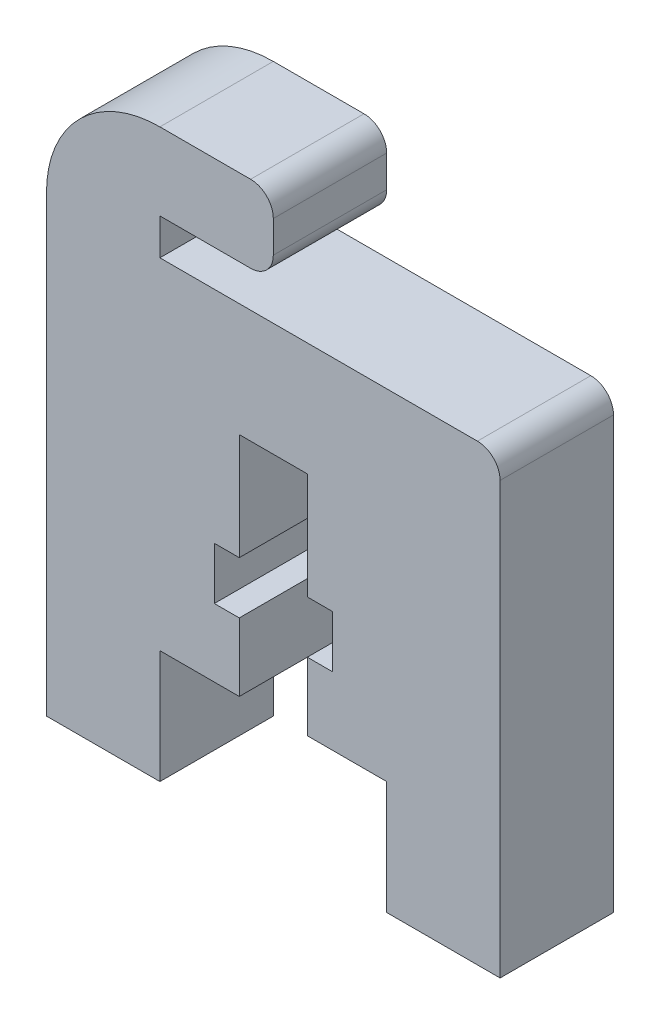
ISO-10303-21;
HEADER;
FILE_DESCRIPTION(('STEP AP214'),'2;1');
FILE_NAME('part.step','',(''),(''),'','','');
FILE_SCHEMA(('AUTOMOTIVE_DESIGN { 1 0 10303 214 1 1 1 1 }'));
ENDSEC;
DATA;
#1=APPLICATION_CONTEXT('core data for automotive mechanical design processes');
#2=APPLICATION_PROTOCOL_DEFINITION('international standard','automotive_design',2000,#1);
#3=PRODUCT_CONTEXT('',#1,'mechanical');
#4=PRODUCT('Part','Part','',(#3));
#5=PRODUCT_RELATED_PRODUCT_CATEGORY('part','',(#4));
#6=PRODUCT_DEFINITION_FORMATION('','',#4);
#7=PRODUCT_DEFINITION_CONTEXT('part definition',#1,'design');
#8=PRODUCT_DEFINITION('design','',#6,#7);
#9=PRODUCT_DEFINITION_SHAPE('','',#8);
#10=(LENGTH_UNIT() NAMED_UNIT(*) SI_UNIT(.MILLI.,.METRE.));
#11=(NAMED_UNIT(*) PLANE_ANGLE_UNIT() SI_UNIT($,.RADIAN.));
#12=(NAMED_UNIT(*) SI_UNIT($,.STERADIAN.) SOLID_ANGLE_UNIT());
#13=UNCERTAINTY_MEASURE_WITH_UNIT(LENGTH_MEASURE(1.E-05),#10,'distance_accuracy_value','');
#14=(GEOMETRIC_REPRESENTATION_CONTEXT(3) GLOBAL_UNCERTAINTY_ASSIGNED_CONTEXT((#13)) GLOBAL_UNIT_ASSIGNED_CONTEXT((#10,
#11,#12)) REPRESENTATION_CONTEXT('',''));
#15=CARTESIAN_POINT('',(0.,0.,0.));
#16=DIRECTION('',(0.,0.,1.));
#17=DIRECTION('',(1.,0.,0.));
#18=AXIS2_PLACEMENT_3D('',#15,#16,#17);
#19=CARTESIAN_POINT('',(5.,0.,5.));
#20=DIRECTION('',(0.,1.,0.));
#21=DIRECTION('',(0.,0.,1.));
#22=AXIS2_PLACEMENT_3D('',#19,#20,#21);
#23=PLANE('',#22);
#24=DIRECTION('',(1.,0.,0.));
#25=VECTOR('',#24,1.);
#26=CARTESIAN_POINT('',(5.,0.,0.));
#27=LINE('',#26,#25);
#28=CARTESIAN_POINT('',(0.,0.,0.));
#29=VERTEX_POINT('',#28);
#30=CARTESIAN_POINT('',(5.,0.,0.));
#31=VERTEX_POINT('',#30);
#32=EDGE_CURVE('E360',#29,#31,#27,.T.);
#33=ORIENTED_EDGE('',*,*,#32,.T.);
#34=DIRECTION('',(0.,0.,-1.));
#35=VECTOR('',#34,1.);
#36=CARTESIAN_POINT('',(5.,0.,5.));
#37=LINE('',#36,#35);
#38=CARTESIAN_POINT('',(5.,0.,5.));
#39=VERTEX_POINT('',#38);
#40=EDGE_CURVE('E233',#39,#31,#37,.T.);
#41=ORIENTED_EDGE('',*,*,#40,.F.);
#42=DIRECTION('',(1.,0.,0.));
#43=VECTOR('',#42,1.);
#44=CARTESIAN_POINT('',(5.,0.,5.));
#45=LINE('',#44,#43);
#46=CARTESIAN_POINT('',(0.,0.,5.));
#47=VERTEX_POINT('',#46);
#48=EDGE_CURVE('E219',#47,#39,#45,.T.);
#49=ORIENTED_EDGE('',*,*,#48,.F.);
#50=DIRECTION('',(0.,0.,-1.));
#51=VECTOR('',#50,1.);
#52=CARTESIAN_POINT('',(0.,0.,5.));
#53=LINE('',#52,#51);
#54=EDGE_CURVE('E231',#47,#29,#53,.T.);
#55=ORIENTED_EDGE('',*,*,#54,.T.);
#56=EDGE_LOOP('',(#33,#41,#49,#55));
#57=FACE_BOUND('',#56,.T.);
#58=ADVANCED_FACE('F32',(#57),#23,.F.);
#59=CARTESIAN_POINT('',(5.,0.,5.));
#60=DIRECTION('',(-1.,0.,0.));
#61=DIRECTION('',(0.,-1.,0.));
#62=AXIS2_PLACEMENT_3D('',#59,#60,#61);
#63=PLANE('',#62);
#64=DIRECTION('',(0.,1.,0.));
#65=VECTOR('',#64,1.);
#66=CARTESIAN_POINT('',(5.,0.,0.));
#67=LINE('',#66,#65);
#68=CARTESIAN_POINT('',(5.,5.,0.));
#69=VERTEX_POINT('',#68);
#70=EDGE_CURVE('E354',#31,#69,#67,.T.);
#71=ORIENTED_EDGE('',*,*,#70,.T.);
#72=DIRECTION('',(0.,0.,-1.));
#73=VECTOR('',#72,1.);
#74=CARTESIAN_POINT('',(5.,5.,5.));
#75=LINE('',#74,#73);
#76=CARTESIAN_POINT('',(5.,5.,5.));
#77=VERTEX_POINT('',#76);
#78=EDGE_CURVE('E244',#77,#69,#75,.T.);
#79=ORIENTED_EDGE('',*,*,#78,.F.);
#80=DIRECTION('',(0.,1.,0.));
#81=VECTOR('',#80,1.);
#82=CARTESIAN_POINT('',(5.,0.,5.));
#83=LINE('',#82,#81);
#84=EDGE_CURVE('E235',#39,#77,#83,.T.);
#85=ORIENTED_EDGE('',*,*,#84,.F.);
#86=ORIENTED_EDGE('',*,*,#40,.T.);
#87=EDGE_LOOP('',(#71,#79,#85,#86));
#88=FACE_BOUND('',#87,.T.);
#89=ADVANCED_FACE('F417',(#88),#63,.F.);
#90=CARTESIAN_POINT('',(8.50000000000001,5.,5.));
#91=DIRECTION('',(0.,1.,0.));
#92=DIRECTION('',(-1.,0.,0.));
#93=AXIS2_PLACEMENT_3D('',#90,#91,#92);
#94=PLANE('',#93);
#95=DIRECTION('',(1.,0.,0.));
#96=VECTOR('',#95,1.);
#97=CARTESIAN_POINT('',(8.50000000000001,5.,0.));
#98=LINE('',#97,#96);
#99=CARTESIAN_POINT('',(8.50000000000001,5.,0.));
#100=VERTEX_POINT('',#99);
#101=EDGE_CURVE('E349',#69,#100,#98,.T.);
#102=ORIENTED_EDGE('',*,*,#101,.T.);
#103=DIRECTION('',(0.,0.,-1.));
#104=VECTOR('',#103,1.);
#105=CARTESIAN_POINT('',(8.50000000000001,5.,5.));
#106=LINE('',#105,#104);
#107=CARTESIAN_POINT('',(8.50000000000001,5.,5.));
#108=VERTEX_POINT('',#107);
#109=EDGE_CURVE('E340',#108,#100,#106,.T.);
#110=ORIENTED_EDGE('',*,*,#109,.F.);
#111=DIRECTION('',(1.,0.,0.));
#112=VECTOR('',#111,1.);
#113=CARTESIAN_POINT('',(8.50000000000001,5.,5.));
#114=LINE('',#113,#112);
#115=EDGE_CURVE('E350',#77,#108,#114,.T.);
#116=ORIENTED_EDGE('',*,*,#115,.F.);
#117=ORIENTED_EDGE('',*,*,#78,.T.);
#118=EDGE_LOOP('',(#102,#110,#116,#117));
#119=FACE_BOUND('',#118,.T.);
#120=ADVANCED_FACE('F347',(#119),#94,.F.);
#121=CARTESIAN_POINT('',(8.5,8.,5.));
#122=DIRECTION('',(-1.,0.,0.));
#123=DIRECTION('',(0.,-1.,0.));
#124=AXIS2_PLACEMENT_3D('',#121,#122,#123);
#125=PLANE('',#124);
#126=DIRECTION('',(0.,1.,0.));
#127=VECTOR('',#126,1.);
#128=CARTESIAN_POINT('',(8.5,8.,0.));
#129=LINE('',#128,#127);
#130=CARTESIAN_POINT('',(8.5,8.,0.));
#131=VERTEX_POINT('',#130);
#132=EDGE_CURVE('E356',#100,#131,#129,.T.);
#133=ORIENTED_EDGE('',*,*,#132,.T.);
#134=DIRECTION('',(0.,0.,-1.));
#135=VECTOR('',#134,1.);
#136=CARTESIAN_POINT('',(8.5,8.,5.));
#137=LINE('',#136,#135);
#138=CARTESIAN_POINT('',(8.5,8.,5.));
#139=VERTEX_POINT('',#138);
#140=EDGE_CURVE('E337',#139,#131,#137,.T.);
#141=ORIENTED_EDGE('',*,*,#140,.F.);
#142=DIRECTION('',(0.,1.,0.));
#143=VECTOR('',#142,1.);
#144=CARTESIAN_POINT('',(8.5,8.,5.));
#145=LINE('',#144,#143);
#146=EDGE_CURVE('E419',#108,#139,#145,.T.);
#147=ORIENTED_EDGE('',*,*,#146,.F.);
#148=ORIENTED_EDGE('',*,*,#109,.T.);
#149=EDGE_LOOP('',(#133,#141,#147,#148));
#150=FACE_BOUND('',#149,.T.);
#151=ADVANCED_FACE('F536',(#150),#125,.F.);
#152=CARTESIAN_POINT('',(8.5,8.,5.));
#153=DIRECTION('',(0.,-1.,0.));
#154=DIRECTION('',(1.,0.,0.));
#155=AXIS2_PLACEMENT_3D('',#152,#153,#154);
#156=PLANE('',#155);
#157=DIRECTION('',(-1.,0.,0.));
#158=VECTOR('',#157,1.);
#159=CARTESIAN_POINT('',(8.5,8.,0.));
#160=LINE('',#159,#158);
#161=CARTESIAN_POINT('',(7.4,8.00000000000001,0.));
#162=VERTEX_POINT('',#161);
#163=EDGE_CURVE('E358',#131,#162,#160,.T.);
#164=ORIENTED_EDGE('',*,*,#163,.T.);
#165=DIRECTION('',(0.,0.,-1.));
#166=VECTOR('',#165,1.);
#167=CARTESIAN_POINT('',(7.4,8.00000000000001,5.));
#168=LINE('',#167,#166);
#169=CARTESIAN_POINT('',(7.4,8.00000000000001,5.));
#170=VERTEX_POINT('',#169);
#171=EDGE_CURVE('E334',#170,#162,#168,.T.);
#172=ORIENTED_EDGE('',*,*,#171,.F.);
#173=DIRECTION('',(-1.,0.,0.));
#174=VECTOR('',#173,1.);
#175=CARTESIAN_POINT('',(8.5,8.,5.));
#176=LINE('',#175,#174);
#177=EDGE_CURVE('E423',#139,#170,#176,.T.);
#178=ORIENTED_EDGE('',*,*,#177,.F.);
#179=ORIENTED_EDGE('',*,*,#140,.T.);
#180=EDGE_LOOP('',(#164,#172,#178,#179));
#181=FACE_BOUND('',#180,.T.);
#182=ADVANCED_FACE('F532',(#181),#156,.F.);
#183=CARTESIAN_POINT('',(7.4,8.00000000000001,5.));
#184=DIRECTION('',(-1.,0.,0.));
#185=DIRECTION('',(0.,-1.,0.));
#186=AXIS2_PLACEMENT_3D('',#183,#184,#185);
#187=PLANE('',#186);
#188=DIRECTION('',(0.,1.,0.));
#189=VECTOR('',#188,1.);
#190=CARTESIAN_POINT('',(7.4,8.00000000000001,0.));
#191=LINE('',#190,#189);
#192=CARTESIAN_POINT('',(7.4,10.3,0.));
#193=VERTEX_POINT('',#192);
#194=EDGE_CURVE('E365',#162,#193,#191,.T.);
#195=ORIENTED_EDGE('',*,*,#194,.T.);
#196=DIRECTION('',(0.,0.,-1.));
#197=VECTOR('',#196,1.);
#198=CARTESIAN_POINT('',(7.4,10.3,5.));
#199=LINE('',#198,#197);
#200=CARTESIAN_POINT('',(7.4,10.3,5.));
#201=VERTEX_POINT('',#200);
#202=EDGE_CURVE('E331',#201,#193,#199,.T.);
#203=ORIENTED_EDGE('',*,*,#202,.F.);
#204=DIRECTION('',(0.,1.,0.));
#205=VECTOR('',#204,1.);
#206=CARTESIAN_POINT('',(7.4,8.00000000000001,5.));
#207=LINE('',#206,#205);
#208=EDGE_CURVE('E425',#170,#201,#207,.T.);
#209=ORIENTED_EDGE('',*,*,#208,.F.);
#210=ORIENTED_EDGE('',*,*,#171,.T.);
#211=EDGE_LOOP('',(#195,#203,#209,#210));
#212=FACE_BOUND('',#211,.T.);
#213=ADVANCED_FACE('F528',(#212),#187,.F.);
#214=CARTESIAN_POINT('',(7.4,10.3,5.));
#215=DIRECTION('',(0.,1.,0.));
#216=DIRECTION('',(-1.,0.,0.));
#217=AXIS2_PLACEMENT_3D('',#214,#215,#216);
#218=PLANE('',#217);
#219=DIRECTION('',(1.,0.,0.));
#220=VECTOR('',#219,1.);
#221=CARTESIAN_POINT('',(7.4,10.3,0.));
#222=LINE('',#221,#220);
#223=CARTESIAN_POINT('',(8.5,10.3,0.));
#224=VERTEX_POINT('',#223);
#225=EDGE_CURVE('E367',#193,#224,#222,.T.);
#226=ORIENTED_EDGE('',*,*,#225,.T.);
#227=DIRECTION('',(0.,0.,-1.));
#228=VECTOR('',#227,1.);
#229=CARTESIAN_POINT('',(8.5,10.3,5.));
#230=LINE('',#229,#228);
#231=CARTESIAN_POINT('',(8.5,10.3,5.));
#232=VERTEX_POINT('',#231);
#233=EDGE_CURVE('E328',#232,#224,#230,.T.);
#234=ORIENTED_EDGE('',*,*,#233,.F.);
#235=DIRECTION('',(1.,0.,0.));
#236=VECTOR('',#235,1.);
#237=CARTESIAN_POINT('',(7.4,10.3,5.));
#238=LINE('',#237,#236);
#239=EDGE_CURVE('E427',#201,#232,#238,.T.);
#240=ORIENTED_EDGE('',*,*,#239,.F.);
#241=ORIENTED_EDGE('',*,*,#202,.T.);
#242=EDGE_LOOP('',(#226,#234,#240,#241));
#243=FACE_BOUND('',#242,.T.);
#244=ADVANCED_FACE('F523',(#243),#218,.F.);
#245=CARTESIAN_POINT('',(8.5,15.,5.));
#246=DIRECTION('',(-1.,0.,0.));
#247=DIRECTION('',(0.,-1.,0.));
#248=AXIS2_PLACEMENT_3D('',#245,#246,#247);
#249=PLANE('',#248);
#250=DIRECTION('',(0.,1.,0.));
#251=VECTOR('',#250,1.);
#252=CARTESIAN_POINT('',(8.5,15.,0.));
#253=LINE('',#252,#251);
#254=CARTESIAN_POINT('',(8.5,15.,0.));
#255=VERTEX_POINT('',#254);
#256=EDGE_CURVE('E369',#224,#255,#253,.T.);
#257=ORIENTED_EDGE('',*,*,#256,.T.);
#258=DIRECTION('',(0.,0.,-1.));
#259=VECTOR('',#258,1.);
#260=CARTESIAN_POINT('',(8.5,15.,5.));
#261=LINE('',#260,#259);
#262=CARTESIAN_POINT('',(8.5,15.,5.));
#263=VERTEX_POINT('',#262);
#264=EDGE_CURVE('E325',#263,#255,#261,.T.);
#265=ORIENTED_EDGE('',*,*,#264,.F.);
#266=DIRECTION('',(0.,1.,0.));
#267=VECTOR('',#266,1.);
#268=CARTESIAN_POINT('',(8.5,15.,5.));
#269=LINE('',#268,#267);
#270=EDGE_CURVE('E429',#232,#263,#269,.T.);
#271=ORIENTED_EDGE('',*,*,#270,.F.);
#272=ORIENTED_EDGE('',*,*,#233,.T.);
#273=EDGE_LOOP('',(#257,#265,#271,#272));
#274=FACE_BOUND('',#273,.T.);
#275=ADVANCED_FACE('F518',(#274),#249,.F.);
#276=CARTESIAN_POINT('',(11.5,15.,5.));
#277=DIRECTION('',(0.,1.,0.));
#278=DIRECTION('',(0.,0.,1.));
#279=AXIS2_PLACEMENT_3D('',#276,#277,#278);
#280=PLANE('',#279);
#281=DIRECTION('',(1.,0.,0.));
#282=VECTOR('',#281,1.);
#283=CARTESIAN_POINT('',(11.5,15.,0.));
#284=LINE('',#283,#282);
#285=CARTESIAN_POINT('',(11.5,15.,0.));
#286=VERTEX_POINT('',#285);
#287=EDGE_CURVE('E371',#255,#286,#284,.T.);
#288=ORIENTED_EDGE('',*,*,#287,.T.);
#289=DIRECTION('',(0.,0.,-1.));
#290=VECTOR('',#289,1.);
#291=CARTESIAN_POINT('',(11.5,15.,5.));
#292=LINE('',#291,#290);
#293=CARTESIAN_POINT('',(11.5,15.,5.));
#294=VERTEX_POINT('',#293);
#295=EDGE_CURVE('E322',#294,#286,#292,.T.);
#296=ORIENTED_EDGE('',*,*,#295,.F.);
#297=DIRECTION('',(1.,0.,0.));
#298=VECTOR('',#297,1.);
#299=CARTESIAN_POINT('',(11.5,15.,5.));
#300=LINE('',#299,#298);
#301=EDGE_CURVE('E431',#263,#294,#300,.T.);
#302=ORIENTED_EDGE('',*,*,#301,.F.);
#303=ORIENTED_EDGE('',*,*,#264,.T.);
#304=EDGE_LOOP('',(#288,#296,#302,#303));
#305=FACE_BOUND('',#304,.T.);
#306=ADVANCED_FACE('F514',(#305),#280,.F.);
#307=CARTESIAN_POINT('',(11.5,10.3,5.));
#308=DIRECTION('',(1.,0.,0.));
#309=DIRECTION('',(0.,0.,-1.));
#310=AXIS2_PLACEMENT_3D('',#307,#308,#309);
#311=PLANE('',#310);
#312=DIRECTION('',(0.,-1.,0.));
#313=VECTOR('',#312,1.);
#314=CARTESIAN_POINT('',(11.5,10.3,0.));
#315=LINE('',#314,#313);
#316=CARTESIAN_POINT('',(11.5,10.3,0.));
#317=VERTEX_POINT('',#316);
#318=EDGE_CURVE('E373',#286,#317,#315,.T.);
#319=ORIENTED_EDGE('',*,*,#318,.T.);
#320=DIRECTION('',(0.,0.,-1.));
#321=VECTOR('',#320,1.);
#322=CARTESIAN_POINT('',(11.5,10.3,5.));
#323=LINE('',#322,#321);
#324=CARTESIAN_POINT('',(11.5,10.3,5.));
#325=VERTEX_POINT('',#324);
#326=EDGE_CURVE('E319',#325,#317,#323,.T.);
#327=ORIENTED_EDGE('',*,*,#326,.F.);
#328=DIRECTION('',(0.,-1.,0.));
#329=VECTOR('',#328,1.);
#330=CARTESIAN_POINT('',(11.5,10.3,5.));
#331=LINE('',#330,#329);
#332=EDGE_CURVE('E433',#294,#325,#331,.T.);
#333=ORIENTED_EDGE('',*,*,#332,.F.);
#334=ORIENTED_EDGE('',*,*,#295,.T.);
#335=EDGE_LOOP('',(#319,#327,#333,#334));
#336=FACE_BOUND('',#335,.T.);
#337=ADVANCED_FACE('F509',(#336),#311,.F.);
#338=CARTESIAN_POINT('',(11.5,10.3,5.));
#339=DIRECTION('',(0.,1.,0.));
#340=DIRECTION('',(-1.,0.,0.));
#341=AXIS2_PLACEMENT_3D('',#338,#339,#340);
#342=PLANE('',#341);
#343=DIRECTION('',(1.,0.,0.));
#344=VECTOR('',#343,1.);
#345=CARTESIAN_POINT('',(11.5,10.3,0.));
#346=LINE('',#345,#344);
#347=CARTESIAN_POINT('',(12.6,10.3,0.));
#348=VERTEX_POINT('',#347);
#349=EDGE_CURVE('E375',#317,#348,#346,.T.);
#350=ORIENTED_EDGE('',*,*,#349,.T.);
#351=DIRECTION('',(0.,0.,-1.));
#352=VECTOR('',#351,1.);
#353=CARTESIAN_POINT('',(12.6,10.3,5.));
#354=LINE('',#353,#352);
#355=CARTESIAN_POINT('',(12.6,10.3,5.));
#356=VERTEX_POINT('',#355);
#357=EDGE_CURVE('E316',#356,#348,#354,.T.);
#358=ORIENTED_EDGE('',*,*,#357,.F.);
#359=DIRECTION('',(1.,0.,0.));
#360=VECTOR('',#359,1.);
#361=CARTESIAN_POINT('',(11.5,10.3,5.));
#362=LINE('',#361,#360);
#363=EDGE_CURVE('E435',#325,#356,#362,.T.);
#364=ORIENTED_EDGE('',*,*,#363,.F.);
#365=ORIENTED_EDGE('',*,*,#326,.T.);
#366=EDGE_LOOP('',(#350,#358,#364,#365));
#367=FACE_BOUND('',#366,.T.);
#368=ADVANCED_FACE('F503',(#367),#342,.F.);
#369=CARTESIAN_POINT('',(12.6,10.3,5.));
#370=DIRECTION('',(1.,0.,0.));
#371=DIRECTION('',(0.,1.,0.));
#372=AXIS2_PLACEMENT_3D('',#369,#370,#371);
#373=PLANE('',#372);
#374=DIRECTION('',(0.,-1.,0.));
#375=VECTOR('',#374,1.);
#376=CARTESIAN_POINT('',(12.6,10.3,0.));
#377=LINE('',#376,#375);
#378=CARTESIAN_POINT('',(12.6,8.,0.));
#379=VERTEX_POINT('',#378);
#380=EDGE_CURVE('E377',#348,#379,#377,.T.);
#381=ORIENTED_EDGE('',*,*,#380,.T.);
#382=DIRECTION('',(0.,0.,-1.));
#383=VECTOR('',#382,1.);
#384=CARTESIAN_POINT('',(12.6,8.,5.));
#385=LINE('',#384,#383);
#386=CARTESIAN_POINT('',(12.6,8.,5.));
#387=VERTEX_POINT('',#386);
#388=EDGE_CURVE('E313',#387,#379,#385,.T.);
#389=ORIENTED_EDGE('',*,*,#388,.F.);
#390=DIRECTION('',(0.,-1.,0.));
#391=VECTOR('',#390,1.);
#392=CARTESIAN_POINT('',(12.6,10.3,5.));
#393=LINE('',#392,#391);
#394=EDGE_CURVE('E437',#356,#387,#393,.T.);
#395=ORIENTED_EDGE('',*,*,#394,.F.);
#396=ORIENTED_EDGE('',*,*,#357,.T.);
#397=EDGE_LOOP('',(#381,#389,#395,#396));
#398=FACE_BOUND('',#397,.T.);
#399=ADVANCED_FACE('F499',(#398),#373,.F.);
#400=CARTESIAN_POINT('',(12.6,8.,5.));
#401=DIRECTION('',(0.,-1.,0.));
#402=DIRECTION('',(0.,0.,-1.));
#403=AXIS2_PLACEMENT_3D('',#400,#401,#402);
#404=PLANE('',#403);
#405=DIRECTION('',(-1.,0.,0.));
#406=VECTOR('',#405,1.);
#407=CARTESIAN_POINT('',(12.6,8.,0.));
#408=LINE('',#407,#406);
#409=CARTESIAN_POINT('',(11.5,8.,0.));
#410=VERTEX_POINT('',#409);
#411=EDGE_CURVE('E379',#379,#410,#408,.T.);
#412=ORIENTED_EDGE('',*,*,#411,.T.);
#413=DIRECTION('',(0.,0.,-1.));
#414=VECTOR('',#413,1.);
#415=CARTESIAN_POINT('',(11.5,8.,5.));
#416=LINE('',#415,#414);
#417=CARTESIAN_POINT('',(11.5,8.,5.));
#418=VERTEX_POINT('',#417);
#419=EDGE_CURVE('E310',#418,#410,#416,.T.);
#420=ORIENTED_EDGE('',*,*,#419,.F.);
#421=DIRECTION('',(-1.,0.,0.));
#422=VECTOR('',#421,1.);
#423=CARTESIAN_POINT('',(12.6,8.,5.));
#424=LINE('',#423,#422);
#425=EDGE_CURVE('E439',#387,#418,#424,.T.);
#426=ORIENTED_EDGE('',*,*,#425,.F.);
#427=ORIENTED_EDGE('',*,*,#388,.T.);
#428=EDGE_LOOP('',(#412,#420,#426,#427));
#429=FACE_BOUND('',#428,.T.);
#430=ADVANCED_FACE('F494',(#429),#404,.F.);
#431=CARTESIAN_POINT('',(11.5,5.,5.));
#432=DIRECTION('',(1.,0.,0.));
#433=DIRECTION('',(0.,1.,0.));
#434=AXIS2_PLACEMENT_3D('',#431,#432,#433);
#435=PLANE('',#434);
#436=DIRECTION('',(0.,-1.,0.));
#437=VECTOR('',#436,1.);
#438=CARTESIAN_POINT('',(11.5,5.,0.));
#439=LINE('',#438,#437);
#440=CARTESIAN_POINT('',(11.5,5.,0.));
#441=VERTEX_POINT('',#440);
#442=EDGE_CURVE('E381',#410,#441,#439,.T.);
#443=ORIENTED_EDGE('',*,*,#442,.T.);
#444=DIRECTION('',(0.,0.,-1.));
#445=VECTOR('',#444,1.);
#446=CARTESIAN_POINT('',(11.5,5.,5.));
#447=LINE('',#446,#445);
#448=CARTESIAN_POINT('',(11.5,5.,5.));
#449=VERTEX_POINT('',#448);
#450=EDGE_CURVE('E307',#449,#441,#447,.T.);
#451=ORIENTED_EDGE('',*,*,#450,.F.);
#452=DIRECTION('',(0.,-1.,0.));
#453=VECTOR('',#452,1.);
#454=CARTESIAN_POINT('',(11.5,5.,5.));
#455=LINE('',#454,#453);
#456=EDGE_CURVE('E441',#418,#449,#455,.T.);
#457=ORIENTED_EDGE('',*,*,#456,.F.);
#458=ORIENTED_EDGE('',*,*,#419,.T.);
#459=EDGE_LOOP('',(#443,#451,#457,#458));
#460=FACE_BOUND('',#459,.T.);
#461=ADVANCED_FACE('F488',(#460),#435,.F.);
#462=CARTESIAN_POINT('',(11.5,5.,5.));
#463=DIRECTION('',(0.,1.,0.));
#464=DIRECTION('',(0.,0.,1.));
#465=AXIS2_PLACEMENT_3D('',#462,#463,#464);
#466=PLANE('',#465);
#467=DIRECTION('',(1.,0.,0.));
#468=VECTOR('',#467,1.);
#469=CARTESIAN_POINT('',(11.5,5.,0.));
#470=LINE('',#469,#468);
#471=CARTESIAN_POINT('',(15.,5.,0.));
#472=VERTEX_POINT('',#471);
#473=EDGE_CURVE('E383',#441,#472,#470,.T.);
#474=ORIENTED_EDGE('',*,*,#473,.T.);
#475=DIRECTION('',(0.,0.,-1.));
#476=VECTOR('',#475,1.);
#477=CARTESIAN_POINT('',(15.,5.,5.));
#478=LINE('',#477,#476);
#479=CARTESIAN_POINT('',(15.,5.,5.));
#480=VERTEX_POINT('',#479);
#481=EDGE_CURVE('E304',#480,#472,#478,.T.);
#482=ORIENTED_EDGE('',*,*,#481,.F.);
#483=DIRECTION('',(1.,0.,0.));
#484=VECTOR('',#483,1.);
#485=CARTESIAN_POINT('',(11.5,5.,5.));
#486=LINE('',#485,#484);
#487=EDGE_CURVE('E443',#449,#480,#486,.T.);
#488=ORIENTED_EDGE('',*,*,#487,.F.);
#489=ORIENTED_EDGE('',*,*,#450,.T.);
#490=EDGE_LOOP('',(#474,#482,#488,#489));
#491=FACE_BOUND('',#490,.T.);
#492=ADVANCED_FACE('F484',(#491),#466,.F.);
#493=CARTESIAN_POINT('',(15.,5.,5.));
#494=DIRECTION('',(1.,0.,0.));
#495=DIRECTION('',(0.,0.,-1.));
#496=AXIS2_PLACEMENT_3D('',#493,#494,#495);
#497=PLANE('',#496);
#498=DIRECTION('',(0.,-1.,0.));
#499=VECTOR('',#498,1.);
#500=CARTESIAN_POINT('',(15.,5.,0.));
#501=LINE('',#500,#499);
#502=CARTESIAN_POINT('',(15.,0.,0.));
#503=VERTEX_POINT('',#502);
#504=EDGE_CURVE('E385',#472,#503,#501,.T.);
#505=ORIENTED_EDGE('',*,*,#504,.T.);
#506=DIRECTION('',(0.,0.,-1.));
#507=VECTOR('',#506,1.);
#508=CARTESIAN_POINT('',(15.,0.,5.));
#509=LINE('',#508,#507);
#510=CARTESIAN_POINT('',(15.,0.,5.));
#511=VERTEX_POINT('',#510);
#512=EDGE_CURVE('E301',#511,#503,#509,.T.);
#513=ORIENTED_EDGE('',*,*,#512,.F.);
#514=DIRECTION('',(0.,-1.,0.));
#515=VECTOR('',#514,1.);
#516=CARTESIAN_POINT('',(15.,5.,5.));
#517=LINE('',#516,#515);
#518=EDGE_CURVE('E445',#480,#511,#517,.T.);
#519=ORIENTED_EDGE('',*,*,#518,.F.);
#520=ORIENTED_EDGE('',*,*,#481,.T.);
#521=EDGE_LOOP('',(#505,#513,#519,#520));
#522=FACE_BOUND('',#521,.T.);
#523=ADVANCED_FACE('F480',(#522),#497,.F.);
#524=CARTESIAN_POINT('',(15.,0.,5.));
#525=DIRECTION('',(0.,1.,0.));
#526=DIRECTION('',(0.,0.,1.));
#527=AXIS2_PLACEMENT_3D('',#524,#525,#526);
#528=PLANE('',#527);
#529=DIRECTION('',(1.,0.,0.));
#530=VECTOR('',#529,1.);
#531=CARTESIAN_POINT('',(15.,0.,0.));
#532=LINE('',#531,#530);
#533=CARTESIAN_POINT('',(20.,0.,0.));
#534=VERTEX_POINT('',#533);
#535=EDGE_CURVE('E387',#503,#534,#532,.T.);
#536=ORIENTED_EDGE('',*,*,#535,.T.);
#537=DIRECTION('',(0.,0.,-1.));
#538=VECTOR('',#537,1.);
#539=CARTESIAN_POINT('',(20.,0.,5.));
#540=LINE('',#539,#538);
#541=CARTESIAN_POINT('',(20.,0.,5.));
#542=VERTEX_POINT('',#541);
#543=EDGE_CURVE('E298',#542,#534,#540,.T.);
#544=ORIENTED_EDGE('',*,*,#543,.F.);
#545=DIRECTION('',(1.,0.,0.));
#546=VECTOR('',#545,1.);
#547=CARTESIAN_POINT('',(15.,0.,5.));
#548=LINE('',#547,#546);
#549=EDGE_CURVE('E447',#511,#542,#548,.T.);
#550=ORIENTED_EDGE('',*,*,#549,.F.);
#551=ORIENTED_EDGE('',*,*,#512,.T.);
#552=EDGE_LOOP('',(#536,#544,#550,#551));
#553=FACE_BOUND('',#552,.T.);
#554=ADVANCED_FACE('F474',(#553),#528,.F.);
#555=CARTESIAN_POINT('',(20.,5.,5.));
#556=DIRECTION('',(-1.,0.,0.));
#557=DIRECTION('',(0.,0.,1.));
#558=AXIS2_PLACEMENT_3D('',#555,#556,#557);
#559=PLANE('',#558);
#560=DIRECTION('',(0.,1.,0.));
#561=VECTOR('',#560,1.);
#562=CARTESIAN_POINT('',(20.,5.,0.));
#563=LINE('',#562,#561);
#564=CARTESIAN_POINT('',(20.,19.,0.));
#565=VERTEX_POINT('',#564);
#566=EDGE_CURVE('E390',#534,#565,#563,.T.);
#567=ORIENTED_EDGE('',*,*,#566,.T.);
#568=DIRECTION('',(0.,0.,-1.));
#569=VECTOR('',#568,1.);
#570=CARTESIAN_POINT('',(20.,19.,5.));
#571=LINE('',#570,#569);
#572=CARTESIAN_POINT('',(20.,19.,5.));
#573=VERTEX_POINT('',#572);
#574=EDGE_CURVE('E261',#565,#573,#571,.F.);
#575=ORIENTED_EDGE('',*,*,#574,.T.);
#576=DIRECTION('',(0.,1.,0.));
#577=VECTOR('',#576,1.);
#578=CARTESIAN_POINT('',(20.,0.,5.));
#579=LINE('',#578,#577);
#580=EDGE_CURVE('E449',#542,#573,#579,.T.);
#581=ORIENTED_EDGE('',*,*,#580,.F.);
#582=ORIENTED_EDGE('',*,*,#543,.T.);
#583=EDGE_LOOP('',(#567,#575,#581,#582));
#584=FACE_BOUND('',#583,.T.);
#585=ADVANCED_FACE('F468',(#584),#559,.F.);
#586=CARTESIAN_POINT('',(20.,20.,5.));
#587=DIRECTION('',(0.,-1.,0.));
#588=DIRECTION('',(1.,0.,0.));
#589=AXIS2_PLACEMENT_3D('',#586,#587,#588);
#590=PLANE('',#589);
#591=DIRECTION('',(-1.,0.,0.));
#592=VECTOR('',#591,1.);
#593=CARTESIAN_POINT('',(20.,20.,5.));
#594=LINE('',#593,#592);
#595=CARTESIAN_POINT('',(19.,20.,5.));
#596=VERTEX_POINT('',#595);
#597=CARTESIAN_POINT('',(5.,20.,5.));
#598=VERTEX_POINT('',#597);
#599=EDGE_CURVE('E452',#596,#598,#594,.T.);
#600=ORIENTED_EDGE('',*,*,#599,.F.);
#601=DIRECTION('',(0.,0.,-1.));
#602=VECTOR('',#601,1.);
#603=CARTESIAN_POINT('',(19.,20.,5.));
#604=LINE('',#603,#602);
#605=CARTESIAN_POINT('',(19.,20.,0.));
#606=VERTEX_POINT('',#605);
#607=EDGE_CURVE('E254',#596,#606,#604,.T.);
#608=ORIENTED_EDGE('',*,*,#607,.T.);
#609=DIRECTION('',(-1.,0.,0.));
#610=VECTOR('',#609,1.);
#611=CARTESIAN_POINT('',(20.,20.,0.));
#612=LINE('',#611,#610);
#613=CARTESIAN_POINT('',(5.,20.,0.));
#614=VERTEX_POINT('',#613);
#615=EDGE_CURVE('E393',#606,#614,#612,.T.);
#616=ORIENTED_EDGE('',*,*,#615,.T.);
#617=DIRECTION('',(0.,0.,-1.));
#618=VECTOR('',#617,1.);
#619=CARTESIAN_POINT('',(5.,20.,5.));
#620=LINE('',#619,#618);
#621=EDGE_CURVE('E295',#598,#614,#620,.T.);
#622=ORIENTED_EDGE('',*,*,#621,.F.);
#623=EDGE_LOOP('',(#600,#608,#616,#622));
#624=FACE_BOUND('',#623,.T.);
#625=ADVANCED_FACE('F460',(#624),#590,.F.);
#626=CARTESIAN_POINT('',(5.,20.,5.));
#627=DIRECTION('',(-1.,0.,0.));
#628=DIRECTION('',(0.,-1.,0.));
#629=AXIS2_PLACEMENT_3D('',#626,#627,#628);
#630=PLANE('',#629);
#631=DIRECTION('',(0.,1.,0.));
#632=VECTOR('',#631,1.);
#633=CARTESIAN_POINT('',(5.,20.,0.));
#634=LINE('',#633,#632);
#635=CARTESIAN_POINT('',(5.,21.6,0.));
#636=VERTEX_POINT('',#635);
#637=EDGE_CURVE('E395',#614,#636,#634,.T.);
#638=ORIENTED_EDGE('',*,*,#637,.T.);
#639=DIRECTION('',(0.,0.,-1.));
#640=VECTOR('',#639,1.);
#641=CARTESIAN_POINT('',(5.,21.6,5.));
#642=LINE('',#641,#640);
#643=CARTESIAN_POINT('',(5.,21.6,5.));
#644=VERTEX_POINT('',#643);
#645=EDGE_CURVE('E292',#644,#636,#642,.T.);
#646=ORIENTED_EDGE('',*,*,#645,.F.);
#647=DIRECTION('',(0.,1.,0.));
#648=VECTOR('',#647,1.);
#649=CARTESIAN_POINT('',(5.,20.,5.));
#650=LINE('',#649,#648);
#651=EDGE_CURVE('E414',#598,#644,#650,.T.);
#652=ORIENTED_EDGE('',*,*,#651,.F.);
#653=ORIENTED_EDGE('',*,*,#621,.T.);
#654=EDGE_LOOP('',(#638,#646,#652,#653));
#655=FACE_BOUND('',#654,.T.);
#656=ADVANCED_FACE('F457',(#655),#630,.F.);
#657=CARTESIAN_POINT('',(5.,21.6,5.));
#658=DIRECTION('',(0.,1.,0.));
#659=DIRECTION('',(-1.,0.,0.));
#660=AXIS2_PLACEMENT_3D('',#657,#658,#659);
#661=PLANE('',#660);
#662=DIRECTION('',(1.,0.,0.));
#663=VECTOR('',#662,1.);
#664=CARTESIAN_POINT('',(5.,21.6,0.));
#665=LINE('',#664,#663);
#666=CARTESIAN_POINT('',(9.,21.6,0.));
#667=VERTEX_POINT('',#666);
#668=EDGE_CURVE('E288',#636,#667,#665,.T.);
#669=ORIENTED_EDGE('',*,*,#668,.T.);
#670=DIRECTION('',(0.,0.,-1.));
#671=VECTOR('',#670,1.);
#672=CARTESIAN_POINT('',(9.,21.6,5.));
#673=LINE('',#672,#671);
#674=CARTESIAN_POINT('',(9.,21.6,5.));
#675=VERTEX_POINT('',#674);
#676=EDGE_CURVE('E270',#667,#675,#673,.F.);
#677=ORIENTED_EDGE('',*,*,#676,.T.);
#678=DIRECTION('',(1.,0.,0.));
#679=VECTOR('',#678,1.);
#680=CARTESIAN_POINT('',(5.,21.6,5.));
#681=LINE('',#680,#679);
#682=EDGE_CURVE('E410',#644,#675,#681,.T.);
#683=ORIENTED_EDGE('',*,*,#682,.F.);
#684=ORIENTED_EDGE('',*,*,#645,.T.);
#685=EDGE_LOOP('',(#669,#677,#683,#684));
#686=FACE_BOUND('',#685,.T.);
#687=ADVANCED_FACE('F400',(#686),#661,.F.);
#688=CARTESIAN_POINT('',(10.,21.6,5.));
#689=DIRECTION('',(-1.,0.,0.));
#690=DIRECTION('',(0.,0.,1.));
#691=AXIS2_PLACEMENT_3D('',#688,#689,#690);
#692=PLANE('',#691);
#693=DIRECTION('',(0.,1.,0.));
#694=VECTOR('',#693,1.);
#695=CARTESIAN_POINT('',(10.,21.6,0.));
#696=LINE('',#695,#694);
#697=CARTESIAN_POINT('',(10.,22.6,0.));
#698=VERTEX_POINT('',#697);
#699=CARTESIAN_POINT('',(10.,24.,0.));
#700=VERTEX_POINT('',#699);
#701=EDGE_CURVE('E285',#698,#700,#696,.T.);
#702=ORIENTED_EDGE('',*,*,#701,.T.);
#703=DIRECTION('',(0.,0.,-1.));
#704=VECTOR('',#703,1.);
#705=CARTESIAN_POINT('',(10.,24.,5.));
#706=LINE('',#705,#704);
#707=CARTESIAN_POINT('',(10.,24.,5.));
#708=VERTEX_POINT('',#707);
#709=EDGE_CURVE('E40',#700,#708,#706,.F.);
#710=ORIENTED_EDGE('',*,*,#709,.T.);
#711=DIRECTION('',(0.,1.,0.));
#712=VECTOR('',#711,1.);
#713=CARTESIAN_POINT('',(10.,21.6,5.));
#714=LINE('',#713,#712);
#715=CARTESIAN_POINT('',(10.,22.6,5.));
#716=VERTEX_POINT('',#715);
#717=EDGE_CURVE('E409',#716,#708,#714,.T.);
#718=ORIENTED_EDGE('',*,*,#717,.F.);
#719=DIRECTION('',(0.,0.,-1.));
#720=VECTOR('',#719,1.);
#721=CARTESIAN_POINT('',(10.,22.6,5.));
#722=LINE('',#721,#720);
#723=EDGE_CURVE('E267',#716,#698,#722,.T.);
#724=ORIENTED_EDGE('',*,*,#723,.T.);
#725=EDGE_LOOP('',(#702,#710,#718,#724));
#726=FACE_BOUND('',#725,.T.);
#727=ADVANCED_FACE('F411',(#726),#692,.F.);
#728=CARTESIAN_POINT('',(10.,25.,5.));
#729=DIRECTION('',(0.,-1.,0.));
#730=DIRECTION('',(1.,0.,0.));
#731=AXIS2_PLACEMENT_3D('',#728,#729,#730);
#732=PLANE('',#731);
#733=DIRECTION('',(-1.,0.,0.));
#734=VECTOR('',#733,1.);
#735=CARTESIAN_POINT('',(10.,25.,5.));
#736=LINE('',#735,#734);
#737=CARTESIAN_POINT('',(9.,25.,5.));
#738=VERTEX_POINT('',#737);
#739=CARTESIAN_POINT('',(5.,25.,5.));
#740=VERTEX_POINT('',#739);
#741=EDGE_CURVE('E280',#738,#740,#736,.T.);
#742=ORIENTED_EDGE('',*,*,#741,.F.);
#743=DIRECTION('',(0.,0.,-1.));
#744=VECTOR('',#743,1.);
#745=CARTESIAN_POINT('',(9.,25.,5.));
#746=LINE('',#745,#744);
#747=CARTESIAN_POINT('',(9.,25.,0.));
#748=VERTEX_POINT('',#747);
#749=EDGE_CURVE('E272',#738,#748,#746,.T.);
#750=ORIENTED_EDGE('',*,*,#749,.T.);
#751=DIRECTION('',(-1.,0.,0.));
#752=VECTOR('',#751,1.);
#753=CARTESIAN_POINT('',(10.,25.,0.));
#754=LINE('',#753,#752);
#755=CARTESIAN_POINT('',(5.,25.,0.));
#756=VERTEX_POINT('',#755);
#757=EDGE_CURVE('E279',#748,#756,#754,.T.);
#758=ORIENTED_EDGE('',*,*,#757,.T.);
#759=DIRECTION('',(0.,0.,-1.));
#760=VECTOR('',#759,1.);
#761=CARTESIAN_POINT('',(5.,25.,5.));
#762=LINE('',#761,#760);
#763=EDGE_CURVE('E250',#756,#740,#762,.F.);
#764=ORIENTED_EDGE('',*,*,#763,.T.);
#765=EDGE_LOOP('',(#742,#750,#758,#764));
#766=FACE_BOUND('',#765,.T.);
#767=ADVANCED_FACE('F278',(#766),#732,.F.);
#768=CARTESIAN_POINT('',(0.,5.,5.));
#769=DIRECTION('',(1.,0.,0.));
#770=DIRECTION('',(0.,1.,0.));
#771=AXIS2_PLACEMENT_3D('',#768,#769,#770);
#772=PLANE('',#771);
#773=DIRECTION('',(0.,-1.,0.));
#774=VECTOR('',#773,1.);
#775=CARTESIAN_POINT('',(0.,0.,5.));
#776=LINE('',#775,#774);
#777=CARTESIAN_POINT('',(0.,20.,5.));
#778=VERTEX_POINT('',#777);
#779=EDGE_CURVE('E216',#778,#47,#776,.T.);
#780=ORIENTED_EDGE('',*,*,#779,.F.);
#781=DIRECTION('',(0.,0.,-1.));
#782=VECTOR('',#781,1.);
#783=CARTESIAN_POINT('',(0.,20.,5.));
#784=LINE('',#783,#782);
#785=CARTESIAN_POINT('',(0.,20.,0.));
#786=VERTEX_POINT('',#785);
#787=EDGE_CURVE('E240',#778,#786,#784,.T.);
#788=ORIENTED_EDGE('',*,*,#787,.T.);
#789=DIRECTION('',(0.,-1.,0.));
#790=VECTOR('',#789,1.);
#791=CARTESIAN_POINT('',(0.,5.,0.));
#792=LINE('',#791,#790);
#793=EDGE_CURVE('E227',#786,#29,#792,.T.);
#794=ORIENTED_EDGE('',*,*,#793,.T.);
#795=ORIENTED_EDGE('',*,*,#54,.F.);
#796=EDGE_LOOP('',(#780,#788,#794,#795));
#797=FACE_BOUND('',#796,.T.);
#798=ADVANCED_FACE('F237',(#797),#772,.F.);
#799=CARTESIAN_POINT('',(0.,0.,5.));
#800=DIRECTION('',(0.,0.,1.));
#801=DIRECTION('',(1.,0.,0.));
#802=AXIS2_PLACEMENT_3D('',#799,#800,#801);
#803=PLANE('',#802);
#804=ORIENTED_EDGE('',*,*,#717,.T.);
#805=CARTESIAN_POINT('',(9.,24.,5.));
#806=DIRECTION('',(0.,0.,1.));
#807=DIRECTION('',(1.,0.,0.));
#808=AXIS2_PLACEMENT_3D('',#805,#806,#807);
#809=CIRCLE('',#808,1.);
#810=EDGE_CURVE('E11',#708,#738,#809,.T.);
#811=ORIENTED_EDGE('',*,*,#810,.T.);
#812=ORIENTED_EDGE('',*,*,#741,.T.);
#813=CARTESIAN_POINT('',(5.,20.,5.));
#814=DIRECTION('',(0.,0.,1.));
#815=DIRECTION('',(1.,0.,0.));
#816=AXIS2_PLACEMENT_3D('',#813,#814,#815);
#817=CIRCLE('',#816,5.);
#818=EDGE_CURVE('E222',#740,#778,#817,.T.);
#819=ORIENTED_EDGE('',*,*,#818,.T.);
#820=ORIENTED_EDGE('',*,*,#779,.T.);
#821=ORIENTED_EDGE('',*,*,#48,.T.);
#822=ORIENTED_EDGE('',*,*,#84,.T.);
#823=ORIENTED_EDGE('',*,*,#115,.T.);
#824=ORIENTED_EDGE('',*,*,#146,.T.);
#825=ORIENTED_EDGE('',*,*,#177,.T.);
#826=ORIENTED_EDGE('',*,*,#208,.T.);
#827=ORIENTED_EDGE('',*,*,#239,.T.);
#828=ORIENTED_EDGE('',*,*,#270,.T.);
#829=ORIENTED_EDGE('',*,*,#301,.T.);
#830=ORIENTED_EDGE('',*,*,#332,.T.);
#831=ORIENTED_EDGE('',*,*,#363,.T.);
#832=ORIENTED_EDGE('',*,*,#394,.T.);
#833=ORIENTED_EDGE('',*,*,#425,.T.);
#834=ORIENTED_EDGE('',*,*,#456,.T.);
#835=ORIENTED_EDGE('',*,*,#487,.T.);
#836=ORIENTED_EDGE('',*,*,#518,.T.);
#837=ORIENTED_EDGE('',*,*,#549,.T.);
#838=ORIENTED_EDGE('',*,*,#580,.T.);
#839=CARTESIAN_POINT('',(19.,19.,5.));
#840=DIRECTION('',(0.,0.,1.));
#841=DIRECTION('',(1.,0.,0.));
#842=AXIS2_PLACEMENT_3D('',#839,#840,#841);
#843=CIRCLE('',#842,1.);
#844=EDGE_CURVE('E265',#573,#596,#843,.T.);
#845=ORIENTED_EDGE('',*,*,#844,.T.);
#846=ORIENTED_EDGE('',*,*,#599,.T.);
#847=ORIENTED_EDGE('',*,*,#651,.T.);
#848=ORIENTED_EDGE('',*,*,#682,.T.);
#849=CARTESIAN_POINT('',(9.,22.6,5.));
#850=DIRECTION('',(0.,0.,1.));
#851=DIRECTION('',(1.,0.,0.));
#852=AXIS2_PLACEMENT_3D('',#849,#850,#851);
#853=CIRCLE('',#852,1.);
#854=EDGE_CURVE('E263',#675,#716,#853,.T.);
#855=ORIENTED_EDGE('',*,*,#854,.T.);
#856=EDGE_LOOP('',(#804,#811,#812,#819,#820,#821,#822,#823,#824,#825,#826,#827,#828,#829,#830,
#831,#832,#833,#834,#835,#836,#837,#838,#845,#846,#847,#848,#855));
#857=FACE_BOUND('',#856,.T.);
#858=ADVANCED_FACE('F218',(#857),#803,.T.);
#859=CARTESIAN_POINT('',(0.,0.,0.));
#860=DIRECTION('',(0.,0.,1.));
#861=DIRECTION('',(1.,0.,0.));
#862=AXIS2_PLACEMENT_3D('',#859,#860,#861);
#863=PLANE('',#862);
#864=ORIENTED_EDGE('',*,*,#757,.F.);
#865=CARTESIAN_POINT('',(9.,24.,0.));
#866=DIRECTION('',(0.,0.,1.));
#867=DIRECTION('',(1.,0.,0.));
#868=AXIS2_PLACEMENT_3D('',#865,#866,#867);
#869=CIRCLE('',#868,1.);
#870=EDGE_CURVE('E54',#748,#700,#869,.F.);
#871=ORIENTED_EDGE('',*,*,#870,.T.);
#872=ORIENTED_EDGE('',*,*,#701,.F.);
#873=CARTESIAN_POINT('',(9.,22.6,0.));
#874=DIRECTION('',(0.,0.,1.));
#875=DIRECTION('',(1.,0.,0.));
#876=AXIS2_PLACEMENT_3D('',#873,#874,#875);
#877=CIRCLE('',#876,1.);
#878=EDGE_CURVE('E257',#698,#667,#877,.F.);
#879=ORIENTED_EDGE('',*,*,#878,.T.);
#880=ORIENTED_EDGE('',*,*,#668,.F.);
#881=ORIENTED_EDGE('',*,*,#637,.F.);
#882=ORIENTED_EDGE('',*,*,#615,.F.);
#883=CARTESIAN_POINT('',(19.,19.,0.));
#884=DIRECTION('',(0.,0.,1.));
#885=DIRECTION('',(1.,0.,0.));
#886=AXIS2_PLACEMENT_3D('',#883,#884,#885);
#887=CIRCLE('',#886,1.);
#888=EDGE_CURVE('E259',#606,#565,#887,.F.);
#889=ORIENTED_EDGE('',*,*,#888,.T.);
#890=ORIENTED_EDGE('',*,*,#566,.F.);
#891=ORIENTED_EDGE('',*,*,#535,.F.);
#892=ORIENTED_EDGE('',*,*,#504,.F.);
#893=ORIENTED_EDGE('',*,*,#473,.F.);
#894=ORIENTED_EDGE('',*,*,#442,.F.);
#895=ORIENTED_EDGE('',*,*,#411,.F.);
#896=ORIENTED_EDGE('',*,*,#380,.F.);
#897=ORIENTED_EDGE('',*,*,#349,.F.);
#898=ORIENTED_EDGE('',*,*,#318,.F.);
#899=ORIENTED_EDGE('',*,*,#287,.F.);
#900=ORIENTED_EDGE('',*,*,#256,.F.);
#901=ORIENTED_EDGE('',*,*,#225,.F.);
#902=ORIENTED_EDGE('',*,*,#194,.F.);
#903=ORIENTED_EDGE('',*,*,#163,.F.);
#904=ORIENTED_EDGE('',*,*,#132,.F.);
#905=ORIENTED_EDGE('',*,*,#101,.F.);
#906=ORIENTED_EDGE('',*,*,#70,.F.);
#907=ORIENTED_EDGE('',*,*,#32,.F.);
#908=ORIENTED_EDGE('',*,*,#793,.F.);
#909=CARTESIAN_POINT('',(5.,20.,0.));
#910=DIRECTION('',(0.,0.,1.));
#911=DIRECTION('',(1.,0.,0.));
#912=AXIS2_PLACEMENT_3D('',#909,#910,#911);
#913=CIRCLE('',#912,5.);
#914=EDGE_CURVE('E242',#786,#756,#913,.F.);
#915=ORIENTED_EDGE('',*,*,#914,.T.);
#916=EDGE_LOOP('',(#864,#871,#872,#879,#880,#881,#882,#889,#890,#891,#892,#893,#894,#895,#896,
#897,#898,#899,#900,#901,#902,#903,#904,#905,#906,#907,#908,#915));
#917=FACE_BOUND('',#916,.T.);
#918=ADVANCED_FACE('F283',(#917),#863,.F.);
#919=CARTESIAN_POINT('',(5.,20.,5.));
#920=DIRECTION('',(0.,0.,-1.));
#921=DIRECTION('',(-1.,0.,0.));
#922=AXIS2_PLACEMENT_3D('',#919,#920,#921);
#923=CYLINDRICAL_SURFACE('',#922,5.);
#924=ORIENTED_EDGE('',*,*,#818,.F.);
#925=ORIENTED_EDGE('',*,*,#763,.F.);
#926=ORIENTED_EDGE('',*,*,#914,.F.);
#927=ORIENTED_EDGE('',*,*,#787,.F.);
#928=EDGE_LOOP('',(#924,#925,#926,#927));
#929=FACE_BOUND('',#928,.T.);
#930=ADVANCED_FACE('F552',(#929),#923,.T.);
#931=CARTESIAN_POINT('',(19.,19.,5.));
#932=DIRECTION('',(0.,0.,-1.));
#933=DIRECTION('',(-1.,0.,0.));
#934=AXIS2_PLACEMENT_3D('',#931,#932,#933);
#935=CYLINDRICAL_SURFACE('',#934,1.);
#936=ORIENTED_EDGE('',*,*,#844,.F.);
#937=ORIENTED_EDGE('',*,*,#574,.F.);
#938=ORIENTED_EDGE('',*,*,#888,.F.);
#939=ORIENTED_EDGE('',*,*,#607,.F.);
#940=EDGE_LOOP('',(#936,#937,#938,#939));
#941=FACE_BOUND('',#940,.T.);
#942=ADVANCED_FACE('F464',(#941),#935,.T.);
#943=CARTESIAN_POINT('',(9.,22.6,5.));
#944=DIRECTION('',(0.,0.,-1.));
#945=DIRECTION('',(-1.,0.,0.));
#946=AXIS2_PLACEMENT_3D('',#943,#944,#945);
#947=CYLINDRICAL_SURFACE('',#946,1.);
#948=ORIENTED_EDGE('',*,*,#854,.F.);
#949=ORIENTED_EDGE('',*,*,#676,.F.);
#950=ORIENTED_EDGE('',*,*,#878,.F.);
#951=ORIENTED_EDGE('',*,*,#723,.F.);
#952=EDGE_LOOP('',(#948,#949,#950,#951));
#953=FACE_BOUND('',#952,.T.);
#954=ADVANCED_FACE('F407',(#953),#947,.T.);
#955=CARTESIAN_POINT('',(9.,24.,5.));
#956=DIRECTION('',(0.,0.,-1.));
#957=DIRECTION('',(-1.,0.,0.));
#958=AXIS2_PLACEMENT_3D('',#955,#956,#957);
#959=CYLINDRICAL_SURFACE('',#958,1.);
#960=ORIENTED_EDGE('',*,*,#810,.F.);
#961=ORIENTED_EDGE('',*,*,#709,.F.);
#962=ORIENTED_EDGE('',*,*,#870,.F.);
#963=ORIENTED_EDGE('',*,*,#749,.F.);
#964=EDGE_LOOP('',(#960,#961,#962,#963));
#965=FACE_BOUND('',#964,.T.);
#966=ADVANCED_FACE('F34',(#965),#959,.T.);
#967=CLOSED_SHELL('',(#58,#89,#120,#151,#182,#213,#244,#275,#306,#337,#368,#399,#430,#461,#492,
#523,#554,#585,#625,#656,#687,#727,#767,#798,#858,#918,#930,#942,#954,#966));
#968=MANIFOLD_SOLID_BREP('B2',#967);
#969=ADVANCED_BREP_SHAPE_REPRESENTATION('',(#18,#968),#14);
#970=SHAPE_DEFINITION_REPRESENTATION(#9,#969);
ENDSEC;
END-ISO-10303-21;
